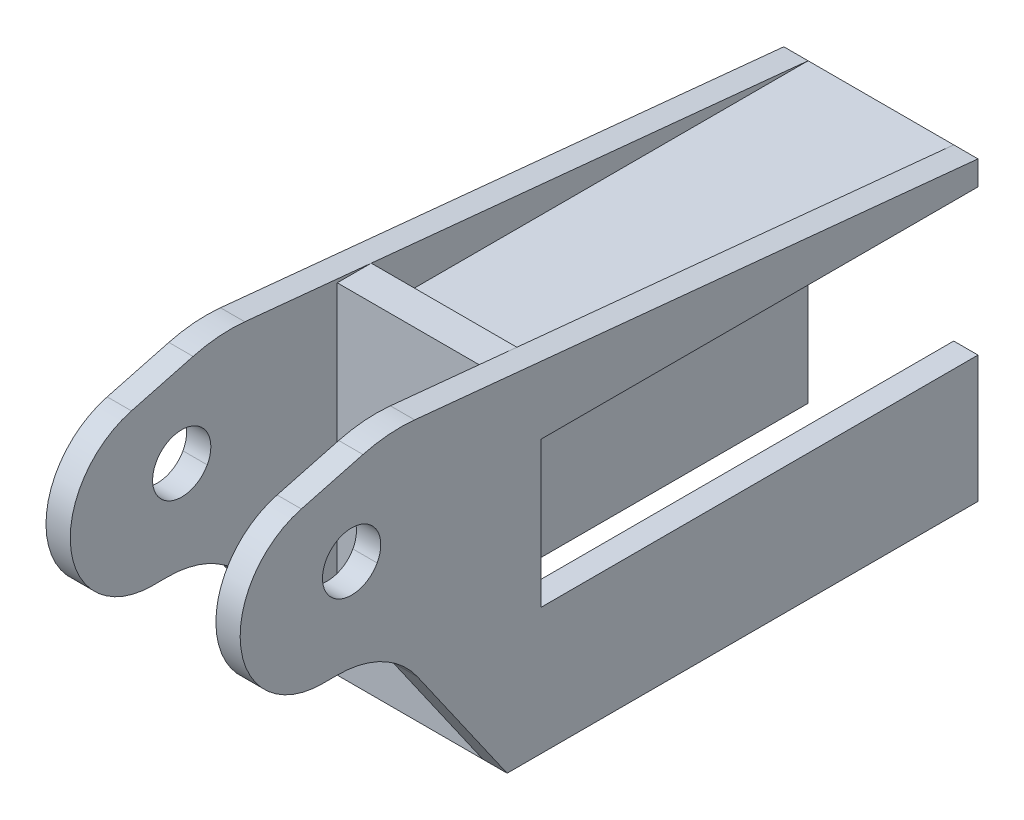
ISO-10303-21;
HEADER;
FILE_DESCRIPTION(('STEP AP214'),'2;1');
FILE_NAME('part.step','',(''),(''),'','','');
FILE_SCHEMA(('AUTOMOTIVE_DESIGN { 1 0 10303 214 1 1 1 1 }'));
ENDSEC;
DATA;
#1=APPLICATION_CONTEXT('core data for automotive mechanical design processes');
#2=APPLICATION_PROTOCOL_DEFINITION('international standard','automotive_design',2000,#1);
#3=PRODUCT_CONTEXT('',#1,'mechanical');
#4=PRODUCT('Part','Part','',(#3));
#5=PRODUCT_RELATED_PRODUCT_CATEGORY('part','',(#4));
#6=PRODUCT_DEFINITION_FORMATION('','',#4);
#7=PRODUCT_DEFINITION_CONTEXT('part definition',#1,'design');
#8=PRODUCT_DEFINITION('design','',#6,#7);
#9=PRODUCT_DEFINITION_SHAPE('','',#8);
#10=(LENGTH_UNIT() NAMED_UNIT(*) SI_UNIT(.MILLI.,.METRE.));
#11=(NAMED_UNIT(*) PLANE_ANGLE_UNIT() SI_UNIT($,.RADIAN.));
#12=(NAMED_UNIT(*) SI_UNIT($,.STERADIAN.) SOLID_ANGLE_UNIT());
#13=UNCERTAINTY_MEASURE_WITH_UNIT(LENGTH_MEASURE(1.E-05),#10,'distance_accuracy_value','');
#14=(GEOMETRIC_REPRESENTATION_CONTEXT(3) GLOBAL_UNCERTAINTY_ASSIGNED_CONTEXT((#13)) GLOBAL_UNIT_ASSIGNED_CONTEXT((#10,
#11,#12)) REPRESENTATION_CONTEXT('',''));
#15=CARTESIAN_POINT('',(0.,0.,0.));
#16=DIRECTION('',(0.,0.,1.));
#17=DIRECTION('',(1.,0.,0.));
#18=AXIS2_PLACEMENT_3D('',#15,#16,#17);
#19=CARTESIAN_POINT('',(0.,0.,0.));
#20=DIRECTION('',(0.,0.,-1.));
#21=DIRECTION('',(-1.,0.,0.));
#22=AXIS2_PLACEMENT_3D('',#19,#20,#21);
#23=PLANE('',#22);
#24=DIRECTION('',(1.,0.,0.));
#25=VECTOR('',#24,1.);
#26=CARTESIAN_POINT('',(-20.,21.11,0.));
#27=LINE('',#26,#25);
#28=CARTESIAN_POINT('',(-20.,21.11,0.));
#29=VERTEX_POINT('',#28);
#30=CARTESIAN_POINT('',(20.,21.11,0.));
#31=VERTEX_POINT('',#30);
#32=EDGE_CURVE('E435',#29,#31,#27,.T.);
#33=ORIENTED_EDGE('',*,*,#32,.T.);
#34=DIRECTION('',(0.,-1.,0.));
#35=VECTOR('',#34,1.);
#36=CARTESIAN_POINT('',(20.,21.11,0.));
#37=LINE('',#36,#35);
#38=CARTESIAN_POINT('',(20.,-8.88999999999998,0.));
#39=VERTEX_POINT('',#38);
#40=EDGE_CURVE('E361',#31,#39,#37,.T.);
#41=ORIENTED_EDGE('',*,*,#40,.T.);
#42=DIRECTION('',(1.,0.,0.));
#43=VECTOR('',#42,1.);
#44=CARTESIAN_POINT('',(15.,-8.88999999999999,0.));
#45=LINE('',#44,#43);
#46=CARTESIAN_POINT('',(15.,-8.88999999999999,0.));
#47=VERTEX_POINT('',#46);
#48=EDGE_CURVE('E309',#47,#39,#45,.T.);
#49=ORIENTED_EDGE('',*,*,#48,.F.);
#50=DIRECTION('',(0.,1.,0.));
#51=VECTOR('',#50,1.);
#52=CARTESIAN_POINT('',(15.,-8.88999999999999,0.));
#53=LINE('',#52,#51);
#54=CARTESIAN_POINT('',(15.,-35.,0.));
#55=VERTEX_POINT('',#54);
#56=EDGE_CURVE('E295',#55,#47,#53,.T.);
#57=ORIENTED_EDGE('',*,*,#56,.F.);
#58=DIRECTION('',(1.,0.,0.));
#59=VECTOR('',#58,1.);
#60=CARTESIAN_POINT('',(-15.,-35.,0.));
#61=LINE('',#60,#59);
#62=CARTESIAN_POINT('',(-15.,-35.,0.));
#63=VERTEX_POINT('',#62);
#64=EDGE_CURVE('E467',#63,#55,#61,.T.);
#65=ORIENTED_EDGE('',*,*,#64,.F.);
#66=DIRECTION('',(0.,-1.,0.));
#67=VECTOR('',#66,1.);
#68=CARTESIAN_POINT('',(-15.,-8.88999999999998,0.));
#69=LINE('',#68,#67);
#70=CARTESIAN_POINT('',(-15.,-8.88999999999998,0.));
#71=VERTEX_POINT('',#70);
#72=EDGE_CURVE('E300',#71,#63,#69,.T.);
#73=ORIENTED_EDGE('',*,*,#72,.F.);
#74=DIRECTION('',(1.,0.,0.));
#75=VECTOR('',#74,1.);
#76=CARTESIAN_POINT('',(-15.,-8.88999999999998,0.));
#77=LINE('',#76,#75);
#78=CARTESIAN_POINT('',(-20.,-8.88999999999998,0.));
#79=VERTEX_POINT('',#78);
#80=EDGE_CURVE('E273',#79,#71,#77,.T.);
#81=ORIENTED_EDGE('',*,*,#80,.F.);
#82=DIRECTION('',(0.,-1.,0.));
#83=VECTOR('',#82,1.);
#84=CARTESIAN_POINT('',(-20.,21.11,0.));
#85=LINE('',#84,#83);
#86=EDGE_CURVE('E268',#29,#79,#85,.T.);
#87=ORIENTED_EDGE('',*,*,#86,.F.);
#88=EDGE_LOOP('',(#33,#41,#49,#57,#65,#73,#81,#87));
#89=FACE_BOUND('',#88,.T.);
#90=ADVANCED_FACE('F50',(#89),#23,.T.);
#91=DIRECTION('',(-1.,0.,0.));
#92=VECTOR('',#91,1.);
#93=CARTESIAN_POINT('',(15.,26.11,0.));
#94=LINE('',#93,#92);
#95=CARTESIAN_POINT('',(15.,26.11,0.));
#96=VERTEX_POINT('',#95);
#97=CARTESIAN_POINT('',(-15.,26.11,0.));
#98=VERTEX_POINT('',#97);
#99=EDGE_CURVE('E66',#96,#98,#94,.T.);
#100=ORIENTED_EDGE('',*,*,#99,.T.);
#101=DIRECTION('',(0.,-1.,0.));
#102=VECTOR('',#101,1.);
#103=CARTESIAN_POINT('',(-15.,-35.,0.));
#104=LINE('',#103,#102);
#105=CARTESIAN_POINT('',(-15.,35.,2.4980018054066E-13));
#106=VERTEX_POINT('',#105);
#107=EDGE_CURVE('E484',#106,#98,#104,.T.);
#108=ORIENTED_EDGE('',*,*,#107,.F.);
#109=DIRECTION('',(-1.,0.,0.));
#110=VECTOR('',#109,1.);
#111=CARTESIAN_POINT('',(-15.,35.,0.));
#112=LINE('',#111,#110);
#113=CARTESIAN_POINT('',(15.,35.0000000000001,6.73072708679001E-13));
#114=VERTEX_POINT('',#113);
#115=EDGE_CURVE('E480',#114,#106,#112,.T.);
#116=ORIENTED_EDGE('',*,*,#115,.F.);
#117=DIRECTION('',(0.,1.,0.));
#118=VECTOR('',#117,1.);
#119=CARTESIAN_POINT('',(15.,-35.,0.));
#120=LINE('',#119,#118);
#121=EDGE_CURVE('E461',#96,#114,#120,.T.);
#122=ORIENTED_EDGE('',*,*,#121,.F.);
#123=EDGE_LOOP('',(#100,#108,#116,#122));
#124=FACE_BOUND('',#123,.T.);
#125=ADVANCED_FACE('F676',(#124),#23,.T.);
#126=CARTESIAN_POINT('',(20.,18.8,39.04));
#127=DIRECTION('',(-1.,0.,0.));
#128=DIRECTION('',(0.,0.,1.));
#129=AXIS2_PLACEMENT_3D('',#126,#127,#128);
#130=CYLINDRICAL_SURFACE('',#129,5.99999999999999);
#131=DIRECTION('',(-1.,0.,0.));
#132=VECTOR('',#131,1.);
#133=CARTESIAN_POINT('',(20.,21.6904957508224,44.2978545353098));
#134=LINE('',#133,#132);
#135=CARTESIAN_POINT('',(15.,21.6904957508224,44.2978545353098));
#136=VERTEX_POINT('',#135);
#137=CARTESIAN_POINT('',(20.,21.6904957508224,44.2978545353098));
#138=VERTEX_POINT('',#137);
#139=EDGE_CURVE('E12',#136,#138,#134,.F.);
#140=ORIENTED_EDGE('',*,*,#139,.F.);
#141=CARTESIAN_POINT('',(15.,18.8,39.04));
#142=DIRECTION('',(1.,0.,0.));
#143=DIRECTION('',(0.,0.,-1.));
#144=AXIS2_PLACEMENT_3D('',#141,#142,#143);
#145=CIRCLE('',#144,5.99999999999999);
#146=CARTESIAN_POINT('',(15.,15.9095042491776,33.7821454646902));
#147=VERTEX_POINT('',#146);
#148=EDGE_CURVE('E345',#147,#136,#145,.T.);
#149=ORIENTED_EDGE('',*,*,#148,.F.);
#150=DIRECTION('',(-1.,0.,0.));
#151=VECTOR('',#150,1.);
#152=CARTESIAN_POINT('',(20.,15.9095042491776,33.7821454646902));
#153=LINE('',#152,#151);
#154=CARTESIAN_POINT('',(20.,15.9095042491776,33.7821454646902));
#155=VERTEX_POINT('',#154);
#156=EDGE_CURVE('E59',#147,#155,#153,.F.);
#157=ORIENTED_EDGE('',*,*,#156,.T.);
#158=CARTESIAN_POINT('',(20.,18.8,39.04));
#159=DIRECTION('',(-1.,0.,0.));
#160=DIRECTION('',(0.,0.,1.));
#161=AXIS2_PLACEMENT_3D('',#158,#159,#160);
#162=CIRCLE('',#161,5.99999999999999);
#163=EDGE_CURVE('E341',#138,#155,#162,.T.);
#164=ORIENTED_EDGE('',*,*,#163,.F.);
#165=EDGE_LOOP('',(#140,#149,#157,#164));
#166=FACE_BOUND('',#165,.T.);
#167=ADVANCED_FACE('F597',(#166),#130,.F.);
#168=DIRECTION('',(-1.,0.,0.));
#169=VECTOR('',#168,1.);
#170=CARTESIAN_POINT('',(20.,21.6904957508224,44.2978545353098));
#171=LINE('',#170,#169);
#172=CARTESIAN_POINT('',(-20.,21.6904957508224,44.2978545353098));
#173=VERTEX_POINT('',#172);
#174=CARTESIAN_POINT('',(-15.,21.6904957508224,44.2978545353098));
#175=VERTEX_POINT('',#174);
#176=EDGE_CURVE('E589',#173,#175,#171,.F.);
#177=ORIENTED_EDGE('',*,*,#176,.F.);
#178=CARTESIAN_POINT('',(-20.,18.8,39.04));
#179=DIRECTION('',(-1.,0.,0.));
#180=DIRECTION('',(0.,0.,1.));
#181=AXIS2_PLACEMENT_3D('',#178,#179,#180);
#182=CIRCLE('',#181,5.99999999999999);
#183=CARTESIAN_POINT('',(-20.,15.9095042491776,33.7821454646902));
#184=VERTEX_POINT('',#183);
#185=EDGE_CURVE('E347',#173,#184,#182,.T.);
#186=ORIENTED_EDGE('',*,*,#185,.T.);
#187=DIRECTION('',(-1.,0.,0.));
#188=VECTOR('',#187,1.);
#189=CARTESIAN_POINT('',(20.,15.9095042491776,33.7821454646902));
#190=LINE('',#189,#188);
#191=CARTESIAN_POINT('',(-15.,15.9095042491776,33.7821454646902));
#192=VERTEX_POINT('',#191);
#193=EDGE_CURVE('E582',#184,#192,#190,.F.);
#194=ORIENTED_EDGE('',*,*,#193,.T.);
#195=CARTESIAN_POINT('',(-15.,18.8,39.04));
#196=DIRECTION('',(-1.,0.,0.));
#197=DIRECTION('',(0.,0.,1.));
#198=AXIS2_PLACEMENT_3D('',#195,#196,#197);
#199=CIRCLE('',#198,5.99999999999999);
#200=EDGE_CURVE('E351',#175,#192,#199,.T.);
#201=ORIENTED_EDGE('',*,*,#200,.F.);
#202=EDGE_LOOP('',(#177,#186,#194,#201));
#203=FACE_BOUND('',#202,.T.);
#204=ADVANCED_FACE('F707',(#203),#130,.F.);
#205=CARTESIAN_POINT('',(20.,-20.,41.8769412456804));
#206=DIRECTION('',(-1.,0.,0.));
#207=DIRECTION('',(0.,0.,1.));
#208=AXIS2_PLACEMENT_3D('',#205,#206,#207);
#209=CYLINDRICAL_SURFACE('',#208,20.);
#210=DIRECTION('',(1.,0.,0.));
#211=VECTOR('',#210,1.);
#212=CARTESIAN_POINT('',(20.,0.,41.8769412456804));
#213=LINE('',#212,#211);
#214=CARTESIAN_POINT('',(15.,0.,41.8769412456804));
#215=VERTEX_POINT('',#214);
#216=CARTESIAN_POINT('',(20.,0.,41.8769412456804));
#217=VERTEX_POINT('',#216);
#218=EDGE_CURVE('E568',#215,#217,#213,.T.);
#219=ORIENTED_EDGE('',*,*,#218,.F.);
#220=CARTESIAN_POINT('',(15.,-20.,41.8769412456804));
#221=DIRECTION('',(1.,0.,0.));
#222=DIRECTION('',(0.,0.,-1.));
#223=AXIS2_PLACEMENT_3D('',#220,#221,#222);
#224=CIRCLE('',#223,20.);
#225=CARTESIAN_POINT('',(15.,-8.54579835045103,25.4817814547095));
#226=VERTEX_POINT('',#225);
#227=EDGE_CURVE('E576',#215,#226,#224,.F.);
#228=ORIENTED_EDGE('',*,*,#227,.T.);
#229=DIRECTION('',(1.,0.,0.));
#230=VECTOR('',#229,1.);
#231=CARTESIAN_POINT('',(20.,-8.54579835045103,25.4817814547095));
#232=LINE('',#231,#230);
#233=CARTESIAN_POINT('',(20.,-8.54579835045103,25.4817814547095));
#234=VERTEX_POINT('',#233);
#235=EDGE_CURVE('E572',#234,#226,#232,.F.);
#236=ORIENTED_EDGE('',*,*,#235,.F.);
#237=CARTESIAN_POINT('',(20.,-20.,41.8769412456804));
#238=DIRECTION('',(1.,0.,0.));
#239=DIRECTION('',(0.,0.,-1.));
#240=AXIS2_PLACEMENT_3D('',#237,#238,#239);
#241=CIRCLE('',#240,20.);
#242=EDGE_CURVE('E579',#234,#217,#241,.T.);
#243=ORIENTED_EDGE('',*,*,#242,.T.);
#244=EDGE_LOOP('',(#219,#228,#236,#243));
#245=FACE_BOUND('',#244,.T.);
#246=ADVANCED_FACE('F52',(#245),#209,.F.);
#247=CARTESIAN_POINT('',(-20.,-20.,41.8769412456804));
#248=DIRECTION('',(1.,0.,0.));
#249=DIRECTION('',(0.,0.,-1.));
#250=AXIS2_PLACEMENT_3D('',#247,#248,#249);
#251=CYLINDRICAL_SURFACE('',#250,20.);
#252=DIRECTION('',(-1.,0.,0.));
#253=VECTOR('',#252,1.);
#254=CARTESIAN_POINT('',(-20.,-8.54579835045102,25.4817814547095));
#255=LINE('',#254,#253);
#256=CARTESIAN_POINT('',(-15.,-8.54579835045103,25.4817814547095));
#257=VERTEX_POINT('',#256);
#258=CARTESIAN_POINT('',(-20.,-8.54579835045103,25.4817814547095));
#259=VERTEX_POINT('',#258);
#260=EDGE_CURVE('E554',#257,#259,#255,.T.);
#261=ORIENTED_EDGE('',*,*,#260,.F.);
#262=CARTESIAN_POINT('',(-15.,-20.,41.8769412456804));
#263=DIRECTION('',(-1.,0.,0.));
#264=DIRECTION('',(0.,0.,1.));
#265=AXIS2_PLACEMENT_3D('',#262,#263,#264);
#266=CIRCLE('',#265,20.);
#267=CARTESIAN_POINT('',(-15.,0.,41.8769412456804));
#268=VERTEX_POINT('',#267);
#269=EDGE_CURVE('E562',#257,#268,#266,.F.);
#270=ORIENTED_EDGE('',*,*,#269,.T.);
#271=DIRECTION('',(-1.,0.,0.));
#272=VECTOR('',#271,1.);
#273=CARTESIAN_POINT('',(-20.,0.,41.8769412456804));
#274=LINE('',#273,#272);
#275=CARTESIAN_POINT('',(-20.,0.,41.8769412456804));
#276=VERTEX_POINT('',#275);
#277=EDGE_CURVE('E558',#276,#268,#274,.F.);
#278=ORIENTED_EDGE('',*,*,#277,.F.);
#279=CARTESIAN_POINT('',(-20.,-20.,41.8769412456804));
#280=DIRECTION('',(-1.,0.,0.));
#281=DIRECTION('',(0.,0.,1.));
#282=AXIS2_PLACEMENT_3D('',#279,#280,#281);
#283=CIRCLE('',#282,20.);
#284=EDGE_CURVE('E565',#276,#259,#283,.T.);
#285=ORIENTED_EDGE('',*,*,#284,.T.);
#286=EDGE_LOOP('',(#261,#270,#278,#285));
#287=FACE_BOUND('',#286,.T.);
#288=ADVANCED_FACE('F755',(#287),#251,.F.);
#289=CARTESIAN_POINT('',(20.,7.71870407953652,29.001508393511));
#290=DIRECTION('',(1.,0.,0.));
#291=DIRECTION('',(0.,0.,-1.));
#292=AXIS2_PLACEMENT_3D('',#289,#290,#291);
#293=CYLINDRICAL_SURFACE('',#292,30.);
#294=DIRECTION('',(1.,0.,0.));
#295=VECTOR('',#294,1.);
#296=CARTESIAN_POINT('',(20.,37.5734107044686,26.0525268168927));
#297=LINE('',#296,#295);
#298=CARTESIAN_POINT('',(15.,37.5734107044686,26.0525268168927));
#299=VERTEX_POINT('',#298);
#300=CARTESIAN_POINT('',(20.,37.5734107044686,26.0525268168927));
#301=VERTEX_POINT('',#300);
#302=EDGE_CURVE('E540',#299,#301,#297,.T.);
#303=ORIENTED_EDGE('',*,*,#302,.F.);
#304=CARTESIAN_POINT('',(15.,7.71870407953652,29.001508393511));
#305=DIRECTION('',(1.,0.,0.));
#306=DIRECTION('',(0.,0.,-1.));
#307=AXIS2_PLACEMENT_3D('',#304,#305,#306);
#308=CIRCLE('',#307,30.);
#309=CARTESIAN_POINT('',(15.,36.7150225140448,36.6965403781487));
#310=VERTEX_POINT('',#309);
#311=EDGE_CURVE('E548',#310,#299,#308,.F.);
#312=ORIENTED_EDGE('',*,*,#311,.F.);
#313=DIRECTION('',(1.,0.,0.));
#314=VECTOR('',#313,1.);
#315=CARTESIAN_POINT('',(20.,36.7150225140448,36.6965403781487));
#316=LINE('',#315,#314);
#317=CARTESIAN_POINT('',(20.,36.7150225140448,36.6965403781487));
#318=VERTEX_POINT('',#317);
#319=EDGE_CURVE('E544',#318,#310,#316,.F.);
#320=ORIENTED_EDGE('',*,*,#319,.F.);
#321=CARTESIAN_POINT('',(20.,7.71870407953652,29.001508393511));
#322=DIRECTION('',(1.,0.,0.));
#323=DIRECTION('',(0.,0.,-1.));
#324=AXIS2_PLACEMENT_3D('',#321,#322,#323);
#325=CIRCLE('',#324,30.);
#326=EDGE_CURVE('E551',#301,#318,#325,.T.);
#327=ORIENTED_EDGE('',*,*,#326,.F.);
#328=EDGE_LOOP('',(#303,#312,#320,#327));
#329=FACE_BOUND('',#328,.T.);
#330=ADVANCED_FACE('F752',(#329),#293,.T.);
#331=CARTESIAN_POINT('',(-20.,7.71870407953651,29.001508393511));
#332=DIRECTION('',(1.,0.,0.));
#333=DIRECTION('',(0.,0.,-1.));
#334=AXIS2_PLACEMENT_3D('',#331,#332,#333);
#335=CYLINDRICAL_SURFACE('',#334,30.);
#336=DIRECTION('',(1.,0.,0.));
#337=VECTOR('',#336,1.);
#338=CARTESIAN_POINT('',(-20.,37.5734107044686,26.0525268168927));
#339=LINE('',#338,#337);
#340=CARTESIAN_POINT('',(-20.,37.5734107044686,26.0525268168927));
#341=VERTEX_POINT('',#340);
#342=CARTESIAN_POINT('',(-15.,37.5734107044686,26.0525268168927));
#343=VERTEX_POINT('',#342);
#344=EDGE_CURVE('E526',#341,#343,#339,.T.);
#345=ORIENTED_EDGE('',*,*,#344,.F.);
#346=CARTESIAN_POINT('',(-20.,7.71870407953651,29.001508393511));
#347=DIRECTION('',(-1.,0.,0.));
#348=DIRECTION('',(0.,0.,1.));
#349=AXIS2_PLACEMENT_3D('',#346,#347,#348);
#350=CIRCLE('',#349,30.);
#351=CARTESIAN_POINT('',(-20.,36.7150225140448,36.6965403781487));
#352=VERTEX_POINT('',#351);
#353=EDGE_CURVE('E534',#352,#341,#350,.T.);
#354=ORIENTED_EDGE('',*,*,#353,.F.);
#355=DIRECTION('',(1.,0.,0.));
#356=VECTOR('',#355,1.);
#357=CARTESIAN_POINT('',(-20.,36.7150225140448,36.6965403781487));
#358=LINE('',#357,#356);
#359=CARTESIAN_POINT('',(-15.,36.7150225140448,36.6965403781487));
#360=VERTEX_POINT('',#359);
#361=EDGE_CURVE('E530',#360,#352,#358,.F.);
#362=ORIENTED_EDGE('',*,*,#361,.F.);
#363=CARTESIAN_POINT('',(-15.,7.71870407953651,29.001508393511));
#364=DIRECTION('',(-1.,0.,0.));
#365=DIRECTION('',(0.,0.,1.));
#366=AXIS2_PLACEMENT_3D('',#363,#364,#365);
#367=CIRCLE('',#366,30.);
#368=EDGE_CURVE('E537',#343,#360,#367,.F.);
#369=ORIENTED_EDGE('',*,*,#368,.F.);
#370=EDGE_LOOP('',(#345,#354,#362,#369));
#371=FACE_BOUND('',#370,.T.);
#372=ADVANCED_FACE('F748',(#371),#335,.T.);
#373=CARTESIAN_POINT('',(15.,16.9564861474822,45.0435138525178));
#374=DIRECTION('',(-1.,0.,0.));
#375=DIRECTION('',(0.,0.,1.));
#376=AXIS2_PLACEMENT_3D('',#373,#374,#375);
#377=CYLINDRICAL_SURFACE('',#376,16.9564861474822);
#378=DIRECTION('',(-1.,0.,0.));
#379=VECTOR('',#378,1.);
#380=CARTESIAN_POINT('',(20.,33.345675209573,49.3928706275825));
#381=LINE('',#380,#379);
#382=CARTESIAN_POINT('',(15.,33.345675209573,49.3928706275825));
#383=VERTEX_POINT('',#382);
#384=CARTESIAN_POINT('',(20.,33.345675209573,49.3928706275825));
#385=VERTEX_POINT('',#384);
#386=EDGE_CURVE('E511',#383,#385,#381,.F.);
#387=ORIENTED_EDGE('',*,*,#386,.F.);
#388=CARTESIAN_POINT('',(15.,16.9564861474822,45.0435138525178));
#389=DIRECTION('',(1.,0.,0.));
#390=DIRECTION('',(0.,0.,-1.));
#391=AXIS2_PLACEMENT_3D('',#388,#389,#390);
#392=CIRCLE('',#391,16.9564861474822);
#393=CARTESIAN_POINT('',(15.,0.,45.0435138525178));
#394=VERTEX_POINT('',#393);
#395=EDGE_CURVE('E519',#394,#383,#392,.F.);
#396=ORIENTED_EDGE('',*,*,#395,.F.);
#397=DIRECTION('',(-1.,0.,0.));
#398=VECTOR('',#397,1.);
#399=CARTESIAN_POINT('',(20.,0.,45.0435138525178));
#400=LINE('',#399,#398);
#401=CARTESIAN_POINT('',(20.,0.,45.0435138525178));
#402=VERTEX_POINT('',#401);
#403=EDGE_CURVE('E515',#402,#394,#400,.T.);
#404=ORIENTED_EDGE('',*,*,#403,.F.);
#405=CARTESIAN_POINT('',(20.,16.9564861474822,45.0435138525178));
#406=DIRECTION('',(1.,0.,0.));
#407=DIRECTION('',(0.,0.,-1.));
#408=AXIS2_PLACEMENT_3D('',#405,#406,#407);
#409=CIRCLE('',#408,16.9564861474822);
#410=EDGE_CURVE('E522',#385,#402,#409,.T.);
#411=ORIENTED_EDGE('',*,*,#410,.F.);
#412=EDGE_LOOP('',(#387,#396,#404,#411));
#413=FACE_BOUND('',#412,.T.);
#414=ADVANCED_FACE('F742',(#413),#377,.T.);
#415=CARTESIAN_POINT('',(-20.,16.9564861474822,45.0435138525178));
#416=DIRECTION('',(1.,0.,0.));
#417=DIRECTION('',(0.,0.,-1.));
#418=AXIS2_PLACEMENT_3D('',#415,#416,#417);
#419=CYLINDRICAL_SURFACE('',#418,16.9564861474822);
#420=DIRECTION('',(1.,0.,0.));
#421=VECTOR('',#420,1.);
#422=CARTESIAN_POINT('',(-20.,33.345675209573,49.3928706275825));
#423=LINE('',#422,#421);
#424=CARTESIAN_POINT('',(-20.,33.345675209573,49.3928706275825));
#425=VERTEX_POINT('',#424);
#426=CARTESIAN_POINT('',(-15.,33.345675209573,49.3928706275825));
#427=VERTEX_POINT('',#426);
#428=EDGE_CURVE('E496',#425,#427,#423,.T.);
#429=ORIENTED_EDGE('',*,*,#428,.F.);
#430=CARTESIAN_POINT('',(-20.,16.9564861474822,45.0435138525178));
#431=DIRECTION('',(-1.,0.,0.));
#432=DIRECTION('',(0.,0.,1.));
#433=AXIS2_PLACEMENT_3D('',#430,#431,#432);
#434=CIRCLE('',#433,16.9564861474822);
#435=CARTESIAN_POINT('',(-20.,0.,45.0435138525178));
#436=VERTEX_POINT('',#435);
#437=EDGE_CURVE('E504',#436,#425,#434,.T.);
#438=ORIENTED_EDGE('',*,*,#437,.F.);
#439=DIRECTION('',(1.,0.,0.));
#440=VECTOR('',#439,1.);
#441=CARTESIAN_POINT('',(-20.,0.,45.0435138525178));
#442=LINE('',#441,#440);
#443=CARTESIAN_POINT('',(-15.,0.,45.0435138525178));
#444=VERTEX_POINT('',#443);
#445=EDGE_CURVE('E500',#444,#436,#442,.F.);
#446=ORIENTED_EDGE('',*,*,#445,.F.);
#447=CARTESIAN_POINT('',(-15.,16.9564861474822,45.0435138525178));
#448=DIRECTION('',(-1.,0.,0.));
#449=DIRECTION('',(0.,0.,1.));
#450=AXIS2_PLACEMENT_3D('',#447,#448,#449);
#451=CIRCLE('',#450,16.9564861474822);
#452=EDGE_CURVE('E507',#427,#444,#451,.F.);
#453=ORIENTED_EDGE('',*,*,#452,.F.);
#454=EDGE_LOOP('',(#429,#438,#446,#453));
#455=FACE_BOUND('',#454,.T.);
#456=ADVANCED_FACE('F735',(#455),#419,.T.);
#457=CARTESIAN_POINT('',(-15.,35.,7.));
#458=DIRECTION('',(0.,-1.,0.));
#459=DIRECTION('',(0.,0.,-1.));
#460=AXIS2_PLACEMENT_3D('',#457,#458,#459);
#461=PLANE('',#460);
#462=ORIENTED_EDGE('',*,*,#115,.T.);
#463=DIRECTION('',(0.,0.,-1.));
#464=VECTOR('',#463,1.);
#465=CARTESIAN_POINT('',(-15.,35.,7.));
#466=LINE('',#465,#464);
#467=CARTESIAN_POINT('',(-15.,35.,7.));
#468=VERTEX_POINT('',#467);
#469=EDGE_CURVE('E477',#468,#106,#466,.T.);
#470=ORIENTED_EDGE('',*,*,#469,.F.);
#471=DIRECTION('',(-1.,0.,0.));
#472=VECTOR('',#471,1.);
#473=CARTESIAN_POINT('',(-15.,35.,7.));
#474=LINE('',#473,#472);
#475=CARTESIAN_POINT('',(15.,35.,7.));
#476=VERTEX_POINT('',#475);
#477=EDGE_CURVE('E466',#476,#468,#474,.T.);
#478=ORIENTED_EDGE('',*,*,#477,.F.);
#479=DIRECTION('',(0.,0.,-1.));
#480=VECTOR('',#479,1.);
#481=CARTESIAN_POINT('',(15.,35.,7.));
#482=LINE('',#481,#480);
#483=EDGE_CURVE('E492',#476,#114,#482,.T.);
#484=ORIENTED_EDGE('',*,*,#483,.T.);
#485=EDGE_LOOP('',(#462,#470,#478,#484));
#486=FACE_BOUND('',#485,.T.);
#487=ADVANCED_FACE('F679',(#486),#461,.F.);
#488=CARTESIAN_POINT('',(-15.,-35.,7.));
#489=DIRECTION('',(0.,1.,0.));
#490=DIRECTION('',(0.,0.,1.));
#491=AXIS2_PLACEMENT_3D('',#488,#489,#490);
#492=PLANE('',#491);
#493=DIRECTION('',(0.,0.,1.));
#494=VECTOR('',#493,1.);
#495=CARTESIAN_POINT('',(-20.,-35.,0.));
#496=LINE('',#495,#494);
#497=CARTESIAN_POINT('',(-20.,-35.,-90.));
#498=VERTEX_POINT('',#497);
#499=CARTESIAN_POINT('',(-20.,-35.,7.));
#500=VERTEX_POINT('',#499);
#501=EDGE_CURVE('E409',#498,#500,#496,.T.);
#502=ORIENTED_EDGE('',*,*,#501,.F.);
#503=DIRECTION('',(-1.,0.,0.));
#504=VECTOR('',#503,1.);
#505=CARTESIAN_POINT('',(-15.,-35.,-90.));
#506=LINE('',#505,#504);
#507=CARTESIAN_POINT('',(-15.,-35.,-90.));
#508=VERTEX_POINT('',#507);
#509=EDGE_CURVE('E287',#508,#498,#506,.T.);
#510=ORIENTED_EDGE('',*,*,#509,.F.);
#511=DIRECTION('',(0.,0.,1.));
#512=VECTOR('',#511,1.);
#513=CARTESIAN_POINT('',(-15.,-35.,-116.584433415065));
#514=LINE('',#513,#512);
#515=EDGE_CURVE('E274',#508,#63,#514,.T.);
#516=ORIENTED_EDGE('',*,*,#515,.T.);
#517=ORIENTED_EDGE('',*,*,#64,.T.);
#518=DIRECTION('',(0.,0.,1.));
#519=VECTOR('',#518,1.);
#520=CARTESIAN_POINT('',(15.,-35.,-116.584433415065));
#521=LINE('',#520,#519);
#522=CARTESIAN_POINT('',(15.,-35.,-90.));
#523=VERTEX_POINT('',#522);
#524=EDGE_CURVE('E289',#523,#55,#521,.T.);
#525=ORIENTED_EDGE('',*,*,#524,.F.);
#526=DIRECTION('',(-1.,0.,0.));
#527=VECTOR('',#526,1.);
#528=CARTESIAN_POINT('',(15.,-35.,-90.));
#529=LINE('',#528,#527);
#530=CARTESIAN_POINT('',(20.,-35.,-90.));
#531=VERTEX_POINT('',#530);
#532=EDGE_CURVE('E331',#531,#523,#529,.T.);
#533=ORIENTED_EDGE('',*,*,#532,.F.);
#534=DIRECTION('',(0.,0.,1.));
#535=VECTOR('',#534,1.);
#536=CARTESIAN_POINT('',(20.,-35.,0.));
#537=LINE('',#536,#535);
#538=CARTESIAN_POINT('',(20.,-35.,7.));
#539=VERTEX_POINT('',#538);
#540=EDGE_CURVE('E357',#531,#539,#537,.T.);
#541=ORIENTED_EDGE('',*,*,#540,.T.);
#542=DIRECTION('',(-1.,0.,0.));
#543=VECTOR('',#542,1.);
#544=CARTESIAN_POINT('',(20.,-35.,7.));
#545=LINE('',#544,#543);
#546=CARTESIAN_POINT('',(15.,-35.,7.));
#547=VERTEX_POINT('',#546);
#548=EDGE_CURVE('E387',#539,#547,#545,.T.);
#549=ORIENTED_EDGE('',*,*,#548,.T.);
#550=DIRECTION('',(1.,0.,0.));
#551=VECTOR('',#550,1.);
#552=CARTESIAN_POINT('',(-15.,-35.,7.));
#553=LINE('',#552,#551);
#554=CARTESIAN_POINT('',(-15.,-35.,7.));
#555=VERTEX_POINT('',#554);
#556=EDGE_CURVE('E473',#555,#547,#553,.T.);
#557=ORIENTED_EDGE('',*,*,#556,.F.);
#558=DIRECTION('',(1.,0.,0.));
#559=VECTOR('',#558,1.);
#560=CARTESIAN_POINT('',(-20.,-35.,7.));
#561=LINE('',#560,#559);
#562=EDGE_CURVE('E457',#500,#555,#561,.T.);
#563=ORIENTED_EDGE('',*,*,#562,.F.);
#564=EDGE_LOOP('',(#502,#510,#516,#517,#525,#533,#541,#549,#557,#563));
#565=FACE_BOUND('',#564,.T.);
#566=ADVANCED_FACE('F690',(#565),#492,.F.);
#567=CARTESIAN_POINT('',(0.,0.,7.));
#568=DIRECTION('',(0.,0.,-1.));
#569=DIRECTION('',(-1.,0.,0.));
#570=AXIS2_PLACEMENT_3D('',#567,#568,#569);
#571=PLANE('',#570);
#572=DIRECTION('',(0.,1.,0.));
#573=VECTOR('',#572,1.);
#574=CARTESIAN_POINT('',(15.,-35.,7.));
#575=LINE('',#574,#573);
#576=EDGE_CURVE('E462',#547,#476,#575,.T.);
#577=ORIENTED_EDGE('',*,*,#576,.T.);
#578=ORIENTED_EDGE('',*,*,#477,.T.);
#579=DIRECTION('',(0.,-1.,0.));
#580=VECTOR('',#579,1.);
#581=CARTESIAN_POINT('',(-15.,-35.,7.));
#582=LINE('',#581,#580);
#583=EDGE_CURVE('E470',#468,#555,#582,.T.);
#584=ORIENTED_EDGE('',*,*,#583,.T.);
#585=ORIENTED_EDGE('',*,*,#556,.T.);
#586=EDGE_LOOP('',(#577,#578,#584,#585));
#587=FACE_BOUND('',#586,.T.);
#588=ADVANCED_FACE('F687',(#587),#571,.F.);
#589=CARTESIAN_POINT('',(-15.,0.,0.));
#590=DIRECTION('',(-1.,0.,0.));
#591=DIRECTION('',(0.,0.,1.));
#592=AXIS2_PLACEMENT_3D('',#589,#590,#591);
#593=PLANE('',#592);
#594=ORIENTED_EDGE('',*,*,#107,.T.);
#595=DIRECTION('',(0.,0.,-1.));
#596=VECTOR('',#595,1.);
#597=CARTESIAN_POINT('',(-15.,26.11,0.));
#598=LINE('',#597,#596);
#599=CARTESIAN_POINT('',(-15.,26.11,-90.));
#600=VERTEX_POINT('',#599);
#601=EDGE_CURVE('E633',#98,#600,#598,.T.);
#602=ORIENTED_EDGE('',*,*,#601,.T.);
#603=DIRECTION('',(0.,-0.0982993858872765,-0.995156887497737));
#604=VECTOR('',#603,1.);
#605=CARTESIAN_POINT('',(-15.,26.11,-90.));
#606=LINE('',#605,#604);
#607=EDGE_CURVE('E445',#106,#600,#606,.T.);
#608=ORIENTED_EDGE('',*,*,#607,.F.);
#609=EDGE_LOOP('',(#594,#602,#608));
#610=FACE_BOUND('',#609,.T.);
#611=ADVANCED_FACE('F674',(#610),#593,.F.);
#612=CARTESIAN_POINT('',(-20.,-35.,7.));
#613=DIRECTION('',(0.,0.572710082477449,-0.819757989548546));
#614=DIRECTION('',(0.,0.819757989548546,0.572710082477449));
#615=AXIS2_PLACEMENT_3D('',#612,#613,#614);
#616=PLANE('',#615);
#617=DIRECTION('',(0.,0.819757989548546,0.572710082477449));
#618=VECTOR('',#617,1.);
#619=CARTESIAN_POINT('',(-15.,-35.,7.));
#620=LINE('',#619,#618);
#621=EDGE_CURVE('E408',#555,#257,#620,.T.);
#622=ORIENTED_EDGE('',*,*,#621,.T.);
#623=ORIENTED_EDGE('',*,*,#260,.T.);
#624=DIRECTION('',(0.,0.819757989548546,0.572710082477449));
#625=VECTOR('',#624,1.);
#626=CARTESIAN_POINT('',(-20.,-35.,7.));
#627=LINE('',#626,#625);
#628=EDGE_CURVE('E412',#500,#259,#627,.T.);
#629=ORIENTED_EDGE('',*,*,#628,.F.);
#630=ORIENTED_EDGE('',*,*,#562,.T.);
#631=EDGE_LOOP('',(#622,#623,#629,#630));
#632=FACE_BOUND('',#631,.T.);
#633=ADVANCED_FACE('F722',(#632),#616,.F.);
#634=CARTESIAN_POINT('',(-20.,0.,31.4521592253706));
#635=DIRECTION('',(0.,1.,0.));
#636=DIRECTION('',(0.,0.,1.));
#637=AXIS2_PLACEMENT_3D('',#634,#635,#636);
#638=PLANE('',#637);
#639=DIRECTION('',(0.,0.,1.));
#640=VECTOR('',#639,1.);
#641=CARTESIAN_POINT('',(-20.,0.,31.4521592253706));
#642=LINE('',#641,#640);
#643=EDGE_CURVE('E417',#276,#436,#642,.T.);
#644=ORIENTED_EDGE('',*,*,#643,.F.);
#645=ORIENTED_EDGE('',*,*,#277,.T.);
#646=DIRECTION('',(0.,0.,1.));
#647=VECTOR('',#646,1.);
#648=CARTESIAN_POINT('',(-15.,0.,31.4521592253706));
#649=LINE('',#648,#647);
#650=EDGE_CURVE('E438',#268,#444,#649,.T.);
#651=ORIENTED_EDGE('',*,*,#650,.T.);
#652=ORIENTED_EDGE('',*,*,#445,.T.);
#653=EDGE_LOOP('',(#644,#645,#651,#652));
#654=FACE_BOUND('',#653,.T.);
#655=ADVANCED_FACE('F1122',(#654),#638,.F.);
#656=CARTESIAN_POINT('',(-20.,30.,62.));
#657=DIRECTION('',(0.,-0.966543947816942,-0.25650106615459));
#658=DIRECTION('',(0.,0.25650106615459,-0.966543947816942));
#659=AXIS2_PLACEMENT_3D('',#656,#657,#658);
#660=PLANE('',#659);
#661=DIRECTION('',(0.,0.25650106615459,-0.966543947816942));
#662=VECTOR('',#661,1.);
#663=CARTESIAN_POINT('',(-15.,30.,62.));
#664=LINE('',#663,#662);
#665=EDGE_CURVE('E441',#427,#360,#664,.T.);
#666=ORIENTED_EDGE('',*,*,#665,.T.);
#667=ORIENTED_EDGE('',*,*,#361,.T.);
#668=DIRECTION('',(0.,0.25650106615459,-0.966543947816942));
#669=VECTOR('',#668,1.);
#670=CARTESIAN_POINT('',(-20.,30.,62.));
#671=LINE('',#670,#669);
#672=EDGE_CURVE('E420',#425,#352,#671,.T.);
#673=ORIENTED_EDGE('',*,*,#672,.F.);
#674=ORIENTED_EDGE('',*,*,#428,.T.);
#675=EDGE_LOOP('',(#666,#667,#673,#674));
#676=FACE_BOUND('',#675,.T.);
#677=ADVANCED_FACE('F901',(#676),#660,.F.);
#678=CARTESIAN_POINT('',(-20.,26.11,-90.));
#679=DIRECTION('',(0.,-0.995156887497737,0.0982993858872765));
#680=DIRECTION('',(0.,-0.0982993858872765,-0.995156887497737));
#681=AXIS2_PLACEMENT_3D('',#678,#679,#680);
#682=PLANE('',#681);
#683=DIRECTION('',(0.,-0.0982993858872766,-0.995156887497737));
#684=VECTOR('',#683,1.);
#685=CARTESIAN_POINT('',(-20.,38.106774394595,31.4521592253706));
#686=LINE('',#685,#684);
#687=CARTESIAN_POINT('',(-20.,26.11,-90.));
#688=VERTEX_POINT('',#687);
#689=EDGE_CURVE('E424',#341,#688,#686,.T.);
#690=ORIENTED_EDGE('',*,*,#689,.F.);
#691=ORIENTED_EDGE('',*,*,#344,.T.);
#692=EDGE_CURVE('E413',#343,#106,#606,.T.);
#693=ORIENTED_EDGE('',*,*,#692,.T.);
#694=ORIENTED_EDGE('',*,*,#607,.T.);
#695=DIRECTION('',(1.,0.,0.));
#696=VECTOR('',#695,1.);
#697=CARTESIAN_POINT('',(-20.,26.11,-90.));
#698=LINE('',#697,#696);
#699=EDGE_CURVE('E453',#688,#600,#698,.T.);
#700=ORIENTED_EDGE('',*,*,#699,.F.);
#701=EDGE_LOOP('',(#690,#691,#693,#694,#700));
#702=FACE_BOUND('',#701,.T.);
#703=ADVANCED_FACE('F671',(#702),#682,.F.);
#704=CARTESIAN_POINT('',(-20.,21.11,-90.));
#705=DIRECTION('',(0.,0.,1.));
#706=DIRECTION('',(1.,0.,0.));
#707=AXIS2_PLACEMENT_3D('',#704,#705,#706);
#708=PLANE('',#707);
#709=ORIENTED_EDGE('',*,*,#699,.T.);
#710=DIRECTION('',(-1.,0.,0.));
#711=VECTOR('',#710,1.);
#712=CARTESIAN_POINT('',(15.,26.11,-90.));
#713=LINE('',#712,#711);
#714=CARTESIAN_POINT('',(15.,26.11,-90.));
#715=VERTEX_POINT('',#714);
#716=EDGE_CURVE('E627',#715,#600,#713,.T.);
#717=ORIENTED_EDGE('',*,*,#716,.F.);
#718=DIRECTION('',(-1.,0.,0.));
#719=VECTOR('',#718,1.);
#720=CARTESIAN_POINT('',(20.,26.11,-90.));
#721=LINE('',#720,#719);
#722=CARTESIAN_POINT('',(20.,26.11,-90.));
#723=VERTEX_POINT('',#722);
#724=EDGE_CURVE('E404',#723,#715,#721,.T.);
#725=ORIENTED_EDGE('',*,*,#724,.F.);
#726=DIRECTION('',(0.,-1.,0.));
#727=VECTOR('',#726,1.);
#728=CARTESIAN_POINT('',(20.,21.11,-90.));
#729=LINE('',#728,#727);
#730=CARTESIAN_POINT('',(20.,21.11,-90.));
#731=VERTEX_POINT('',#730);
#732=EDGE_CURVE('E369',#723,#731,#729,.T.);
#733=ORIENTED_EDGE('',*,*,#732,.T.);
#734=DIRECTION('',(1.,0.,0.));
#735=VECTOR('',#734,1.);
#736=CARTESIAN_POINT('',(-20.,21.11,-90.));
#737=LINE('',#736,#735);
#738=CARTESIAN_POINT('',(-20.,21.11,-90.));
#739=VERTEX_POINT('',#738);
#740=EDGE_CURVE('E450',#739,#731,#737,.T.);
#741=ORIENTED_EDGE('',*,*,#740,.F.);
#742=DIRECTION('',(0.,-1.,0.));
#743=VECTOR('',#742,1.);
#744=CARTESIAN_POINT('',(-20.,21.11,-90.));
#745=LINE('',#744,#743);
#746=EDGE_CURVE('E427',#688,#739,#745,.T.);
#747=ORIENTED_EDGE('',*,*,#746,.F.);
#748=EDGE_LOOP('',(#709,#717,#725,#733,#741,#747));
#749=FACE_BOUND('',#748,.T.);
#750=ADVANCED_FACE('F624',(#749),#708,.F.);
#751=CARTESIAN_POINT('',(-20.,21.11,-90.));
#752=DIRECTION('',(0.,1.,0.));
#753=DIRECTION('',(0.,0.,1.));
#754=AXIS2_PLACEMENT_3D('',#751,#752,#753);
#755=PLANE('',#754);
#756=ORIENTED_EDGE('',*,*,#740,.T.);
#757=DIRECTION('',(0.,0.,1.));
#758=VECTOR('',#757,1.);
#759=CARTESIAN_POINT('',(20.,21.11,-90.));
#760=LINE('',#759,#758);
#761=EDGE_CURVE('E365',#731,#31,#760,.T.);
#762=ORIENTED_EDGE('',*,*,#761,.T.);
#763=ORIENTED_EDGE('',*,*,#32,.F.);
#764=DIRECTION('',(0.,0.,1.));
#765=VECTOR('',#764,1.);
#766=CARTESIAN_POINT('',(-20.,21.11,-90.));
#767=LINE('',#766,#765);
#768=EDGE_CURVE('E430',#739,#29,#767,.T.);
#769=ORIENTED_EDGE('',*,*,#768,.F.);
#770=EDGE_LOOP('',(#756,#762,#763,#769));
#771=FACE_BOUND('',#770,.T.);
#772=ADVANCED_FACE('F718',(#771),#755,.F.);
#773=CARTESIAN_POINT('',(-20.,0.,0.));
#774=DIRECTION('',(-1.,0.,0.));
#775=DIRECTION('',(0.,0.,1.));
#776=AXIS2_PLACEMENT_3D('',#773,#774,#775);
#777=PLANE('',#776);
#778=ORIENTED_EDGE('',*,*,#185,.F.);
#779=EDGE_CURVE('E322',#184,#173,#182,.T.);
#780=ORIENTED_EDGE('',*,*,#779,.F.);
#781=EDGE_LOOP('',(#778,#780));
#782=FACE_BOUND('',#781,.T.);
#783=ORIENTED_EDGE('',*,*,#284,.F.);
#784=ORIENTED_EDGE('',*,*,#643,.T.);
#785=ORIENTED_EDGE('',*,*,#437,.T.);
#786=ORIENTED_EDGE('',*,*,#672,.T.);
#787=ORIENTED_EDGE('',*,*,#353,.T.);
#788=ORIENTED_EDGE('',*,*,#689,.T.);
#789=ORIENTED_EDGE('',*,*,#746,.T.);
#790=ORIENTED_EDGE('',*,*,#768,.T.);
#791=ORIENTED_EDGE('',*,*,#86,.T.);
#792=DIRECTION('',(0.,0.,1.));
#793=VECTOR('',#792,1.);
#794=CARTESIAN_POINT('',(-20.,-8.88999999999998,-116.584433415065));
#795=LINE('',#794,#793);
#796=CARTESIAN_POINT('',(-20.,-8.88999999999998,-90.));
#797=VERTEX_POINT('',#796);
#798=EDGE_CURVE('E260',#797,#79,#795,.T.);
#799=ORIENTED_EDGE('',*,*,#798,.F.);
#800=DIRECTION('',(0.,1.,0.));
#801=VECTOR('',#800,1.);
#802=CARTESIAN_POINT('',(-20.,-8.88999999999998,-90.));
#803=LINE('',#802,#801);
#804=EDGE_CURVE('E265',#498,#797,#803,.T.);
#805=ORIENTED_EDGE('',*,*,#804,.F.);
#806=ORIENTED_EDGE('',*,*,#501,.T.);
#807=ORIENTED_EDGE('',*,*,#628,.T.);
#808=EDGE_LOOP('',(#783,#784,#785,#786,#787,#788,#789,#790,#791,#799,#805,#806,#807));
#809=FACE_BOUND('',#808,.T.);
#810=ADVANCED_FACE('F262',(#782,#809),#777,.T.);
#811=ORIENTED_EDGE('',*,*,#200,.T.);
#812=EDGE_CURVE('E356',#192,#175,#199,.T.);
#813=ORIENTED_EDGE('',*,*,#812,.T.);
#814=EDGE_LOOP('',(#811,#813));
#815=FACE_BOUND('',#814,.T.);
#816=ORIENTED_EDGE('',*,*,#692,.F.);
#817=ORIENTED_EDGE('',*,*,#368,.T.);
#818=ORIENTED_EDGE('',*,*,#665,.F.);
#819=ORIENTED_EDGE('',*,*,#452,.T.);
#820=ORIENTED_EDGE('',*,*,#650,.F.);
#821=ORIENTED_EDGE('',*,*,#269,.F.);
#822=ORIENTED_EDGE('',*,*,#621,.F.);
#823=ORIENTED_EDGE('',*,*,#583,.F.);
#824=ORIENTED_EDGE('',*,*,#469,.T.);
#825=EDGE_LOOP('',(#816,#817,#818,#819,#820,#821,#822,#823,#824));
#826=FACE_BOUND('',#825,.T.);
#827=ADVANCED_FACE('F683',(#815,#826),#593,.F.);
#828=CARTESIAN_POINT('',(15.,0.,0.));
#829=DIRECTION('',(1.,0.,0.));
#830=DIRECTION('',(0.,0.,1.));
#831=AXIS2_PLACEMENT_3D('',#828,#829,#830);
#832=PLANE('',#831);
#833=DIRECTION('',(0.,-0.0982993858872766,-0.995156887497737));
#834=VECTOR('',#833,1.);
#835=CARTESIAN_POINT('',(15.,38.106774394595,31.4521592253706));
#836=LINE('',#835,#834);
#837=EDGE_CURVE('E355',#114,#715,#836,.T.);
#838=ORIENTED_EDGE('',*,*,#837,.T.);
#839=DIRECTION('',(0.,0.,-1.));
#840=VECTOR('',#839,1.);
#841=CARTESIAN_POINT('',(15.,26.11,0.));
#842=LINE('',#841,#840);
#843=EDGE_CURVE('E74',#96,#715,#842,.T.);
#844=ORIENTED_EDGE('',*,*,#843,.F.);
#845=ORIENTED_EDGE('',*,*,#121,.T.);
#846=EDGE_LOOP('',(#838,#844,#845));
#847=FACE_BOUND('',#846,.T.);
#848=ADVANCED_FACE('F711',(#847),#832,.F.);
#849=CARTESIAN_POINT('',(20.,38.106774394595,31.4521592253706));
#850=DIRECTION('',(0.,0.995156887497737,-0.0982993858872766));
#851=DIRECTION('',(0.,0.0982993858872766,0.995156887497737));
#852=AXIS2_PLACEMENT_3D('',#849,#850,#851);
#853=PLANE('',#852);
#854=EDGE_CURVE('E388',#299,#114,#836,.T.);
#855=ORIENTED_EDGE('',*,*,#854,.F.);
#856=ORIENTED_EDGE('',*,*,#302,.T.);
#857=DIRECTION('',(0.,-0.0982993858872765,-0.995156887497737));
#858=VECTOR('',#857,1.);
#859=CARTESIAN_POINT('',(20.,26.11,-90.));
#860=LINE('',#859,#858);
#861=EDGE_CURVE('E373',#301,#723,#860,.T.);
#862=ORIENTED_EDGE('',*,*,#861,.T.);
#863=ORIENTED_EDGE('',*,*,#724,.T.);
#864=ORIENTED_EDGE('',*,*,#837,.F.);
#865=EDGE_LOOP('',(#855,#856,#862,#863,#864));
#866=FACE_BOUND('',#865,.T.);
#867=ADVANCED_FACE('F619',(#866),#853,.T.);
#868=CARTESIAN_POINT('',(20.,30.,62.));
#869=DIRECTION('',(0.,0.966543947816942,0.25650106615459));
#870=DIRECTION('',(0.,-0.25650106615459,0.966543947816942));
#871=AXIS2_PLACEMENT_3D('',#868,#869,#870);
#872=PLANE('',#871);
#873=DIRECTION('',(0.,0.25650106615459,-0.966543947816942));
#874=VECTOR('',#873,1.);
#875=CARTESIAN_POINT('',(20.,30.,62.));
#876=LINE('',#875,#874);
#877=EDGE_CURVE('E376',#385,#318,#876,.T.);
#878=ORIENTED_EDGE('',*,*,#877,.T.);
#879=ORIENTED_EDGE('',*,*,#319,.T.);
#880=DIRECTION('',(0.,0.25650106615459,-0.966543947816942));
#881=VECTOR('',#880,1.);
#882=CARTESIAN_POINT('',(15.,30.,62.));
#883=LINE('',#882,#881);
#884=EDGE_CURVE('E391',#383,#310,#883,.T.);
#885=ORIENTED_EDGE('',*,*,#884,.F.);
#886=ORIENTED_EDGE('',*,*,#386,.T.);
#887=EDGE_LOOP('',(#878,#879,#885,#886));
#888=FACE_BOUND('',#887,.T.);
#889=ADVANCED_FACE('F798',(#888),#872,.T.);
#890=CARTESIAN_POINT('',(20.,0.,31.4521592253706));
#891=DIRECTION('',(0.,-1.,0.));
#892=DIRECTION('',(0.,0.,-1.));
#893=AXIS2_PLACEMENT_3D('',#890,#891,#892);
#894=PLANE('',#893);
#895=DIRECTION('',(0.,0.,1.));
#896=VECTOR('',#895,1.);
#897=CARTESIAN_POINT('',(15.,0.,31.4521592253706));
#898=LINE('',#897,#896);
#899=EDGE_CURVE('E395',#215,#394,#898,.T.);
#900=ORIENTED_EDGE('',*,*,#899,.F.);
#901=ORIENTED_EDGE('',*,*,#218,.T.);
#902=DIRECTION('',(0.,0.,1.));
#903=VECTOR('',#902,1.);
#904=CARTESIAN_POINT('',(20.,0.,31.4521592253706));
#905=LINE('',#904,#903);
#906=EDGE_CURVE('E380',#217,#402,#905,.T.);
#907=ORIENTED_EDGE('',*,*,#906,.T.);
#908=ORIENTED_EDGE('',*,*,#403,.T.);
#909=EDGE_LOOP('',(#900,#901,#907,#908));
#910=FACE_BOUND('',#909,.T.);
#911=ADVANCED_FACE('F795',(#910),#894,.T.);
#912=CARTESIAN_POINT('',(20.,-35.,7.));
#913=DIRECTION('',(0.,-0.572710082477449,0.819757989548546));
#914=DIRECTION('',(0.,-0.819757989548546,-0.572710082477449));
#915=AXIS2_PLACEMENT_3D('',#912,#913,#914);
#916=PLANE('',#915);
#917=DIRECTION('',(0.,0.819757989548546,0.572710082477449));
#918=VECTOR('',#917,1.);
#919=CARTESIAN_POINT('',(20.,-35.,7.));
#920=LINE('',#919,#918);
#921=EDGE_CURVE('E383',#539,#234,#920,.T.);
#922=ORIENTED_EDGE('',*,*,#921,.T.);
#923=ORIENTED_EDGE('',*,*,#235,.T.);
#924=DIRECTION('',(0.,0.819757989548546,0.572710082477449));
#925=VECTOR('',#924,1.);
#926=CARTESIAN_POINT('',(15.,-35.,7.));
#927=LINE('',#926,#925);
#928=EDGE_CURVE('E362',#547,#226,#927,.T.);
#929=ORIENTED_EDGE('',*,*,#928,.F.);
#930=ORIENTED_EDGE('',*,*,#548,.F.);
#931=EDGE_LOOP('',(#922,#923,#929,#930));
#932=FACE_BOUND('',#931,.T.);
#933=ADVANCED_FACE('F609',(#932),#916,.T.);
#934=CARTESIAN_POINT('',(20.,0.,0.));
#935=DIRECTION('',(1.,0.,0.));
#936=DIRECTION('',(0.,0.,1.));
#937=AXIS2_PLACEMENT_3D('',#934,#935,#936);
#938=PLANE('',#937);
#939=ORIENTED_EDGE('',*,*,#163,.T.);
#940=EDGE_CURVE('E346',#155,#138,#162,.T.);
#941=ORIENTED_EDGE('',*,*,#940,.T.);
#942=EDGE_LOOP('',(#939,#941));
#943=FACE_BOUND('',#942,.T.);
#944=ORIENTED_EDGE('',*,*,#861,.F.);
#945=ORIENTED_EDGE('',*,*,#326,.T.);
#946=ORIENTED_EDGE('',*,*,#877,.F.);
#947=ORIENTED_EDGE('',*,*,#410,.T.);
#948=ORIENTED_EDGE('',*,*,#906,.F.);
#949=ORIENTED_EDGE('',*,*,#242,.F.);
#950=ORIENTED_EDGE('',*,*,#921,.F.);
#951=ORIENTED_EDGE('',*,*,#540,.F.);
#952=DIRECTION('',(0.,-1.,0.));
#953=VECTOR('',#952,1.);
#954=CARTESIAN_POINT('',(20.,-8.88999999999999,-90.));
#955=LINE('',#954,#953);
#956=CARTESIAN_POINT('',(20.,-8.88999999999999,-90.));
#957=VERTEX_POINT('',#956);
#958=EDGE_CURVE('E318',#957,#531,#955,.T.);
#959=ORIENTED_EDGE('',*,*,#958,.F.);
#960=DIRECTION('',(0.,0.,1.));
#961=VECTOR('',#960,1.);
#962=CARTESIAN_POINT('',(20.,-8.88999999999999,-116.584433415065));
#963=LINE('',#962,#961);
#964=EDGE_CURVE('E313',#957,#39,#963,.T.);
#965=ORIENTED_EDGE('',*,*,#964,.T.);
#966=ORIENTED_EDGE('',*,*,#40,.F.);
#967=ORIENTED_EDGE('',*,*,#761,.F.);
#968=ORIENTED_EDGE('',*,*,#732,.F.);
#969=EDGE_LOOP('',(#944,#945,#946,#947,#948,#949,#950,#951,#959,#965,#966,#967,#968));
#970=FACE_BOUND('',#969,.T.);
#971=ADVANCED_FACE('F605',(#943,#970),#938,.T.);
#972=EDGE_CURVE('E583',#136,#147,#145,.T.);
#973=ORIENTED_EDGE('',*,*,#972,.T.);
#974=ORIENTED_EDGE('',*,*,#148,.T.);
#975=EDGE_LOOP('',(#973,#974));
#976=FACE_BOUND('',#975,.T.);
#977=ORIENTED_EDGE('',*,*,#227,.F.);
#978=ORIENTED_EDGE('',*,*,#899,.T.);
#979=ORIENTED_EDGE('',*,*,#395,.T.);
#980=ORIENTED_EDGE('',*,*,#884,.T.);
#981=ORIENTED_EDGE('',*,*,#311,.T.);
#982=ORIENTED_EDGE('',*,*,#854,.T.);
#983=ORIENTED_EDGE('',*,*,#483,.F.);
#984=ORIENTED_EDGE('',*,*,#576,.F.);
#985=ORIENTED_EDGE('',*,*,#928,.T.);
#986=EDGE_LOOP('',(#977,#978,#979,#980,#981,#982,#983,#984,#985));
#987=FACE_BOUND('',#986,.T.);
#988=ADVANCED_FACE('F608',(#976,#987),#832,.F.);
#989=ORIENTED_EDGE('',*,*,#972,.F.);
#990=ORIENTED_EDGE('',*,*,#139,.T.);
#991=ORIENTED_EDGE('',*,*,#940,.F.);
#992=ORIENTED_EDGE('',*,*,#156,.F.);
#993=EDGE_LOOP('',(#989,#990,#991,#992));
#994=FACE_BOUND('',#993,.T.);
#995=ADVANCED_FACE('F602',(#994),#130,.F.);
#996=ORIENTED_EDGE('',*,*,#779,.T.);
#997=ORIENTED_EDGE('',*,*,#176,.T.);
#998=ORIENTED_EDGE('',*,*,#812,.F.);
#999=ORIENTED_EDGE('',*,*,#193,.F.);
#1000=EDGE_LOOP('',(#996,#997,#998,#999));
#1001=FACE_BOUND('',#1000,.T.);
#1002=ADVANCED_FACE('F703',(#1001),#130,.F.);
#1003=CARTESIAN_POINT('',(15.,-8.88999999999999,-116.584433415065));
#1004=DIRECTION('',(1.,0.,0.));
#1005=DIRECTION('',(0.,1.,0.));
#1006=AXIS2_PLACEMENT_3D('',#1003,#1004,#1005);
#1007=PLANE('',#1006);
#1008=DIRECTION('',(0.,1.,0.));
#1009=VECTOR('',#1008,1.);
#1010=CARTESIAN_POINT('',(15.,-8.88999999999999,-90.));
#1011=LINE('',#1010,#1009);
#1012=CARTESIAN_POINT('',(15.,-8.88999999999999,-90.));
#1013=VERTEX_POINT('',#1012);
#1014=EDGE_CURVE('E327',#523,#1013,#1011,.T.);
#1015=ORIENTED_EDGE('',*,*,#1014,.F.);
#1016=ORIENTED_EDGE('',*,*,#524,.T.);
#1017=ORIENTED_EDGE('',*,*,#56,.T.);
#1018=DIRECTION('',(0.,0.,1.));
#1019=VECTOR('',#1018,1.);
#1020=CARTESIAN_POINT('',(15.,-8.88999999999999,-116.584433415065));
#1021=LINE('',#1020,#1019);
#1022=EDGE_CURVE('E314',#1013,#47,#1021,.T.);
#1023=ORIENTED_EDGE('',*,*,#1022,.F.);
#1024=EDGE_LOOP('',(#1015,#1016,#1017,#1023));
#1025=FACE_BOUND('',#1024,.T.);
#1026=ADVANCED_FACE('F784',(#1025),#1007,.F.);
#1027=CARTESIAN_POINT('',(15.,-8.88999999999999,-116.584433415065));
#1028=DIRECTION('',(0.,-1.,0.));
#1029=DIRECTION('',(0.,0.,-1.));
#1030=AXIS2_PLACEMENT_3D('',#1027,#1028,#1029);
#1031=PLANE('',#1030);
#1032=DIRECTION('',(1.,0.,0.));
#1033=VECTOR('',#1032,1.);
#1034=CARTESIAN_POINT('',(15.,-8.88999999999999,-90.));
#1035=LINE('',#1034,#1033);
#1036=EDGE_CURVE('E323',#1013,#957,#1035,.T.);
#1037=ORIENTED_EDGE('',*,*,#1036,.F.);
#1038=ORIENTED_EDGE('',*,*,#1022,.T.);
#1039=ORIENTED_EDGE('',*,*,#48,.T.);
#1040=ORIENTED_EDGE('',*,*,#964,.F.);
#1041=EDGE_LOOP('',(#1037,#1038,#1039,#1040));
#1042=FACE_BOUND('',#1041,.T.);
#1043=ADVANCED_FACE('F775',(#1042),#1031,.F.);
#1044=CARTESIAN_POINT('',(20.,21.11,-90.));
#1045=DIRECTION('',(0.,0.,-1.));
#1046=DIRECTION('',(-1.,0.,0.));
#1047=AXIS2_PLACEMENT_3D('',#1044,#1045,#1046);
#1048=PLANE('',#1047);
#1049=ORIENTED_EDGE('',*,*,#532,.T.);
#1050=ORIENTED_EDGE('',*,*,#1014,.T.);
#1051=ORIENTED_EDGE('',*,*,#1036,.T.);
#1052=ORIENTED_EDGE('',*,*,#958,.T.);
#1053=EDGE_LOOP('',(#1049,#1050,#1051,#1052));
#1054=FACE_BOUND('',#1053,.T.);
#1055=ADVANCED_FACE('F768',(#1054),#1048,.T.);
#1056=CARTESIAN_POINT('',(-15.,-8.88999999999998,-116.584433415065));
#1057=DIRECTION('',(-1.,0.,0.));
#1058=DIRECTION('',(0.,-1.,0.));
#1059=AXIS2_PLACEMENT_3D('',#1056,#1057,#1058);
#1060=PLANE('',#1059);
#1061=DIRECTION('',(0.,-1.,0.));
#1062=VECTOR('',#1061,1.);
#1063=CARTESIAN_POINT('',(-15.,-8.88999999999998,-90.));
#1064=LINE('',#1063,#1062);
#1065=CARTESIAN_POINT('',(-15.,-8.88999999999998,-90.));
#1066=VERTEX_POINT('',#1065);
#1067=EDGE_CURVE('E284',#1066,#508,#1064,.T.);
#1068=ORIENTED_EDGE('',*,*,#1067,.F.);
#1069=DIRECTION('',(0.,0.,1.));
#1070=VECTOR('',#1069,1.);
#1071=CARTESIAN_POINT('',(-15.,-8.88999999999998,-116.584433415065));
#1072=LINE('',#1071,#1070);
#1073=EDGE_CURVE('E279',#1066,#71,#1072,.T.);
#1074=ORIENTED_EDGE('',*,*,#1073,.T.);
#1075=ORIENTED_EDGE('',*,*,#72,.T.);
#1076=ORIENTED_EDGE('',*,*,#515,.F.);
#1077=EDGE_LOOP('',(#1068,#1074,#1075,#1076));
#1078=FACE_BOUND('',#1077,.T.);
#1079=ADVANCED_FACE('F766',(#1078),#1060,.F.);
#1080=CARTESIAN_POINT('',(-15.,-8.88999999999998,-116.584433415065));
#1081=DIRECTION('',(0.,-1.,0.));
#1082=DIRECTION('',(0.,0.,-1.));
#1083=AXIS2_PLACEMENT_3D('',#1080,#1081,#1082);
#1084=PLANE('',#1083);
#1085=DIRECTION('',(1.,0.,0.));
#1086=VECTOR('',#1085,1.);
#1087=CARTESIAN_POINT('',(-15.,-8.88999999999998,-90.));
#1088=LINE('',#1087,#1086);
#1089=EDGE_CURVE('E277',#797,#1066,#1088,.T.);
#1090=ORIENTED_EDGE('',*,*,#1089,.F.);
#1091=ORIENTED_EDGE('',*,*,#798,.T.);
#1092=ORIENTED_EDGE('',*,*,#80,.T.);
#1093=ORIENTED_EDGE('',*,*,#1073,.F.);
#1094=EDGE_LOOP('',(#1090,#1091,#1092,#1093));
#1095=FACE_BOUND('',#1094,.T.);
#1096=ADVANCED_FACE('F278',(#1095),#1084,.F.);
#1097=CARTESIAN_POINT('',(20.,21.11,-90.));
#1098=DIRECTION('',(0.,0.,-1.));
#1099=DIRECTION('',(-1.,0.,0.));
#1100=AXIS2_PLACEMENT_3D('',#1097,#1098,#1099);
#1101=PLANE('',#1100);
#1102=ORIENTED_EDGE('',*,*,#1089,.T.);
#1103=ORIENTED_EDGE('',*,*,#1067,.T.);
#1104=ORIENTED_EDGE('',*,*,#509,.T.);
#1105=ORIENTED_EDGE('',*,*,#804,.T.);
#1106=EDGE_LOOP('',(#1102,#1103,#1104,#1105));
#1107=FACE_BOUND('',#1106,.T.);
#1108=ADVANCED_FACE('F286',(#1107),#1101,.T.);
#1109=CARTESIAN_POINT('',(0.,26.11,0.));
#1110=DIRECTION('',(0.,1.,0.));
#1111=DIRECTION('',(0.,0.,1.));
#1112=AXIS2_PLACEMENT_3D('',#1109,#1110,#1111);
#1113=PLANE('',#1112);
#1114=ORIENTED_EDGE('',*,*,#843,.T.);
#1115=ORIENTED_EDGE('',*,*,#716,.T.);
#1116=ORIENTED_EDGE('',*,*,#601,.F.);
#1117=ORIENTED_EDGE('',*,*,#99,.F.);
#1118=EDGE_LOOP('',(#1114,#1115,#1116,#1117));
#1119=FACE_BOUND('',#1118,.T.);
#1120=ADVANCED_FACE('F635',(#1119),#1113,.T.);
#1121=CLOSED_SHELL('',(#90,#125,#167,#204,#246,#288,#330,#372,#414,#456,#487,#566,#588,#611,
#633,#655,#677,#703,#750,#772,#810,#827,#848,#867,#889,#911,#933,#971,#988,#995,#1002,#1026,
#1043,#1055,#1079,#1096,#1108,#1120));
#1122=MANIFOLD_SOLID_BREP('B2',#1121);
#1123=ADVANCED_BREP_SHAPE_REPRESENTATION('',(#18,#1122),#14);
#1124=SHAPE_DEFINITION_REPRESENTATION(#9,#1123);
ENDSEC;
END-ISO-10303-21;
